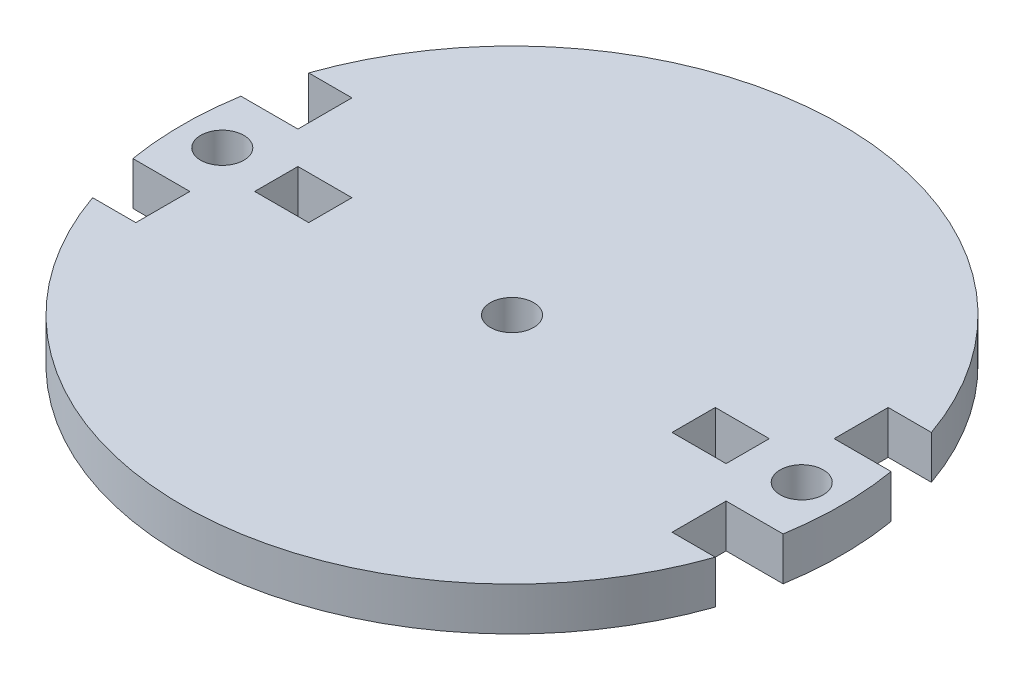
ISO-10303-21;
HEADER;
FILE_DESCRIPTION(('STEP AP214'),'2;1');
FILE_NAME('part.step','',(''),(''),'','','');
FILE_SCHEMA(('AUTOMOTIVE_DESIGN { 1 0 10303 214 1 1 1 1 }'));
ENDSEC;
DATA;
#1=APPLICATION_CONTEXT('core data for automotive mechanical design processes');
#2=APPLICATION_PROTOCOL_DEFINITION('international standard','automotive_design',2000,#1);
#3=PRODUCT_CONTEXT('',#1,'mechanical');
#4=PRODUCT('Part','Part','',(#3));
#5=PRODUCT_RELATED_PRODUCT_CATEGORY('part','',(#4));
#6=PRODUCT_DEFINITION_FORMATION('','',#4);
#7=PRODUCT_DEFINITION_CONTEXT('part definition',#1,'design');
#8=PRODUCT_DEFINITION('design','',#6,#7);
#9=PRODUCT_DEFINITION_SHAPE('','',#8);
#10=(LENGTH_UNIT() NAMED_UNIT(*) SI_UNIT(.MILLI.,.METRE.));
#11=(NAMED_UNIT(*) PLANE_ANGLE_UNIT() SI_UNIT($,.RADIAN.));
#12=(NAMED_UNIT(*) SI_UNIT($,.STERADIAN.) SOLID_ANGLE_UNIT());
#13=UNCERTAINTY_MEASURE_WITH_UNIT(LENGTH_MEASURE(1.E-05),#10,'distance_accuracy_value','');
#14=(GEOMETRIC_REPRESENTATION_CONTEXT(3) GLOBAL_UNCERTAINTY_ASSIGNED_CONTEXT((#13)) GLOBAL_UNIT_ASSIGNED_CONTEXT((#10,
#11,#12)) REPRESENTATION_CONTEXT('',''));
#15=CARTESIAN_POINT('',(0.,0.,0.));
#16=DIRECTION('',(0.,0.,1.));
#17=DIRECTION('',(1.,0.,0.));
#18=AXIS2_PLACEMENT_3D('',#15,#16,#17);
#19=CARTESIAN_POINT('',(0.,4.,0.));
#20=DIRECTION('',(0.,1.,0.));
#21=DIRECTION('',(0.,0.,1.));
#22=AXIS2_PLACEMENT_3D('',#19,#20,#21);
#23=PLANE('',#22);
#24=CARTESIAN_POINT('',(-26.8140590684478,4.,0.));
#25=DIRECTION('',(0.,1.,0.));
#26=DIRECTION('',(0.,0.,1.));
#27=AXIS2_PLACEMENT_3D('',#24,#25,#26);
#28=CIRCLE('',#27,2.);
#29=CARTESIAN_POINT('',(-26.8140590684478,4.,2.));
#30=VERTEX_POINT('',#29);
#31=EDGE_CURVE('E485',#30,#30,#28,.T.);
#32=ORIENTED_EDGE('',*,*,#31,.F.);
#33=EDGE_LOOP('',(#32));
#34=FACE_BOUND('',#33,.T.);
#35=CARTESIAN_POINT('',(26.8140590684478,4.,0.));
#36=DIRECTION('',(0.,1.,0.));
#37=DIRECTION('',(0.,0.,-1.));
#38=AXIS2_PLACEMENT_3D('',#35,#36,#37);
#39=CIRCLE('',#38,2.);
#40=CARTESIAN_POINT('',(26.8140590684478,4.,-2.));
#41=VERTEX_POINT('',#40);
#42=EDGE_CURVE('E220',#41,#41,#39,.T.);
#43=ORIENTED_EDGE('',*,*,#42,.F.);
#44=EDGE_LOOP('',(#43));
#45=FACE_BOUND('',#44,.T.);
#46=DIRECTION('',(0.,0.,1.));
#47=VECTOR('',#46,1.);
#48=CARTESIAN_POINT('',(16.8140590684478,4.,2.));
#49=LINE('',#48,#47);
#50=CARTESIAN_POINT('',(16.8140590684478,4.,-2.));
#51=VERTEX_POINT('',#50);
#52=CARTESIAN_POINT('',(16.8140590684478,4.,2.));
#53=VERTEX_POINT('',#52);
#54=EDGE_CURVE('E50',#51,#53,#49,.T.);
#55=ORIENTED_EDGE('',*,*,#54,.F.);
#56=DIRECTION('',(-1.,0.,0.));
#57=VECTOR('',#56,1.);
#58=CARTESIAN_POINT('',(16.8140590684478,4.,-2.));
#59=LINE('',#58,#57);
#60=CARTESIAN_POINT('',(21.8140590684478,4.,-2.));
#61=VERTEX_POINT('',#60);
#62=EDGE_CURVE('E214',#61,#51,#59,.T.);
#63=ORIENTED_EDGE('',*,*,#62,.F.);
#64=DIRECTION('',(0.,0.,-1.));
#65=VECTOR('',#64,1.);
#66=CARTESIAN_POINT('',(21.8140590684478,4.,-2.));
#67=LINE('',#66,#65);
#68=CARTESIAN_POINT('',(21.8140590684478,4.,2.));
#69=VERTEX_POINT('',#68);
#70=EDGE_CURVE('E217',#69,#61,#67,.T.);
#71=ORIENTED_EDGE('',*,*,#70,.F.);
#72=DIRECTION('',(1.,0.,0.));
#73=VECTOR('',#72,1.);
#74=CARTESIAN_POINT('',(16.8140590684478,4.,2.));
#75=LINE('',#74,#73);
#76=EDGE_CURVE('E226',#53,#69,#75,.T.);
#77=ORIENTED_EDGE('',*,*,#76,.F.);
#78=EDGE_LOOP('',(#55,#63,#71,#77));
#79=FACE_BOUND('',#78,.T.);
#80=DIRECTION('',(0.,0.,-1.));
#81=VECTOR('',#80,1.);
#82=CARTESIAN_POINT('',(-16.8140590684478,4.,2.));
#83=LINE('',#82,#81);
#84=CARTESIAN_POINT('',(-16.8140590684478,4.,2.));
#85=VERTEX_POINT('',#84);
#86=CARTESIAN_POINT('',(-16.8140590684478,4.,-2.));
#87=VERTEX_POINT('',#86);
#88=EDGE_CURVE('E233',#85,#87,#83,.T.);
#89=ORIENTED_EDGE('',*,*,#88,.F.);
#90=DIRECTION('',(1.,0.,0.));
#91=VECTOR('',#90,1.);
#92=CARTESIAN_POINT('',(-16.8140590684478,4.,2.));
#93=LINE('',#92,#91);
#94=CARTESIAN_POINT('',(-21.8140590684478,4.,2.));
#95=VERTEX_POINT('',#94);
#96=EDGE_CURVE('E241',#95,#85,#93,.T.);
#97=ORIENTED_EDGE('',*,*,#96,.F.);
#98=DIRECTION('',(0.,0.,1.));
#99=VECTOR('',#98,1.);
#100=CARTESIAN_POINT('',(-21.8140590684478,4.,-2.));
#101=LINE('',#100,#99);
#102=CARTESIAN_POINT('',(-21.8140590684478,4.,-2.));
#103=VERTEX_POINT('',#102);
#104=EDGE_CURVE('E255',#103,#95,#101,.T.);
#105=ORIENTED_EDGE('',*,*,#104,.F.);
#106=DIRECTION('',(-1.,0.,0.));
#107=VECTOR('',#106,1.);
#108=CARTESIAN_POINT('',(-16.8140590684478,4.,-2.));
#109=LINE('',#108,#107);
#110=EDGE_CURVE('E252',#87,#103,#109,.T.);
#111=ORIENTED_EDGE('',*,*,#110,.F.);
#112=EDGE_LOOP('',(#89,#97,#105,#111));
#113=FACE_BOUND('',#112,.T.);
#114=CARTESIAN_POINT('',(0.,4.,0.));
#115=DIRECTION('',(0.,1.,0.));
#116=DIRECTION('',(0.,0.,1.));
#117=AXIS2_PLACEMENT_3D('',#114,#115,#116);
#118=CIRCLE('',#117,2.);
#119=CARTESIAN_POINT('',(0.,4.,2.));
#120=VERTEX_POINT('',#119);
#121=EDGE_CURVE('E364',#120,#120,#118,.T.);
#122=ORIENTED_EDGE('',*,*,#121,.F.);
#123=EDGE_LOOP('',(#122));
#124=FACE_BOUND('',#123,.T.);
#125=DIRECTION('',(0.,0.,1.));
#126=VECTOR('',#125,1.);
#127=CARTESIAN_POINT('',(24.8140590684478,4.,0.));
#128=LINE('',#127,#126);
#129=CARTESIAN_POINT('',(24.8140590684478,4.,5.));
#130=VERTEX_POINT('',#129);
#131=CARTESIAN_POINT('',(24.8140590684478,4.,10.));
#132=VERTEX_POINT('',#131);
#133=EDGE_CURVE('E262',#130,#132,#128,.T.);
#134=ORIENTED_EDGE('',*,*,#133,.F.);
#135=DIRECTION('',(1.,0.,0.));
#136=VECTOR('',#135,1.);
#137=CARTESIAN_POINT('',(0.,4.,5.));
#138=LINE('',#137,#136);
#139=CARTESIAN_POINT('',(30.0873727666608,4.,5.));
#140=VERTEX_POINT('',#139);
#141=EDGE_CURVE('E273',#130,#140,#138,.T.);
#142=ORIENTED_EDGE('',*,*,#141,.T.);
#143=CARTESIAN_POINT('',(0.,4.,0.));
#144=DIRECTION('',(0.,1.,0.));
#145=DIRECTION('',(0.,0.,1.));
#146=AXIS2_PLACEMENT_3D('',#143,#144,#145);
#147=CIRCLE('',#146,30.5);
#148=CARTESIAN_POINT('',(30.0873727666608,4.,-5.));
#149=VERTEX_POINT('',#148);
#150=EDGE_CURVE('E42',#140,#149,#147,.T.);
#151=ORIENTED_EDGE('',*,*,#150,.T.);
#152=DIRECTION('',(1.,0.,0.));
#153=VECTOR('',#152,1.);
#154=CARTESIAN_POINT('',(0.,4.,-5.00000000000001));
#155=LINE('',#154,#153);
#156=CARTESIAN_POINT('',(24.8140590684478,4.,-5.));
#157=VERTEX_POINT('',#156);
#158=EDGE_CURVE('E297',#157,#149,#155,.T.);
#159=ORIENTED_EDGE('',*,*,#158,.F.);
#160=DIRECTION('',(0.,0.,-1.));
#161=VECTOR('',#160,1.);
#162=CARTESIAN_POINT('',(24.8140590684478,4.,0.));
#163=LINE('',#162,#161);
#164=CARTESIAN_POINT('',(24.8140590684478,4.,-10.));
#165=VERTEX_POINT('',#164);
#166=EDGE_CURVE('E305',#157,#165,#163,.T.);
#167=ORIENTED_EDGE('',*,*,#166,.T.);
#168=DIRECTION('',(1.,0.,0.));
#169=VECTOR('',#168,1.);
#170=CARTESIAN_POINT('',(0.,4.,-10.));
#171=LINE('',#170,#169);
#172=CARTESIAN_POINT('',(28.8140590684478,4.,-10.));
#173=VERTEX_POINT('',#172);
#174=EDGE_CURVE('E287',#165,#173,#171,.T.);
#175=ORIENTED_EDGE('',*,*,#174,.T.);
#176=CARTESIAN_POINT('',(-28.8140590684478,4.,-10.));
#177=VERTEX_POINT('',#176);
#178=EDGE_CURVE('E430',#173,#177,#147,.T.);
#179=ORIENTED_EDGE('',*,*,#178,.T.);
#180=DIRECTION('',(-1.,0.,0.));
#181=VECTOR('',#180,1.);
#182=CARTESIAN_POINT('',(0.,4.,-10.));
#183=LINE('',#182,#181);
#184=CARTESIAN_POINT('',(-24.8140590684478,4.,-10.));
#185=VERTEX_POINT('',#184);
#186=EDGE_CURVE('E322',#185,#177,#183,.T.);
#187=ORIENTED_EDGE('',*,*,#186,.F.);
#188=DIRECTION('',(0.,0.,-1.));
#189=VECTOR('',#188,1.);
#190=CARTESIAN_POINT('',(-24.8140590684478,4.,0.));
#191=LINE('',#190,#189);
#192=CARTESIAN_POINT('',(-24.8140590684478,4.,-5.));
#193=VERTEX_POINT('',#192);
#194=EDGE_CURVE('E331',#193,#185,#191,.T.);
#195=ORIENTED_EDGE('',*,*,#194,.F.);
#196=DIRECTION('',(-1.,0.,0.));
#197=VECTOR('',#196,1.);
#198=CARTESIAN_POINT('',(0.,4.,-5.));
#199=LINE('',#198,#197);
#200=CARTESIAN_POINT('',(-30.0873727666608,4.,-5.));
#201=VERTEX_POINT('',#200);
#202=EDGE_CURVE('E312',#193,#201,#199,.T.);
#203=ORIENTED_EDGE('',*,*,#202,.T.);
#204=CARTESIAN_POINT('',(-30.0873727666608,4.,5.));
#205=VERTEX_POINT('',#204);
#206=EDGE_CURVE('E43',#201,#205,#147,.T.);
#207=ORIENTED_EDGE('',*,*,#206,.T.);
#208=DIRECTION('',(-1.,0.,0.));
#209=VECTOR('',#208,1.);
#210=CARTESIAN_POINT('',(0.,4.,5.00000000000001));
#211=LINE('',#210,#209);
#212=CARTESIAN_POINT('',(-24.8140590684478,4.,5.));
#213=VERTEX_POINT('',#212);
#214=EDGE_CURVE('E338',#213,#205,#211,.T.);
#215=ORIENTED_EDGE('',*,*,#214,.F.);
#216=DIRECTION('',(0.,0.,1.));
#217=VECTOR('',#216,1.);
#218=CARTESIAN_POINT('',(-24.8140590684478,4.,0.));
#219=LINE('',#218,#217);
#220=CARTESIAN_POINT('',(-24.8140590684478,4.,10.));
#221=VERTEX_POINT('',#220);
#222=EDGE_CURVE('E349',#213,#221,#219,.T.);
#223=ORIENTED_EDGE('',*,*,#222,.T.);
#224=DIRECTION('',(-1.,0.,0.));
#225=VECTOR('',#224,1.);
#226=CARTESIAN_POINT('',(0.,4.,10.));
#227=LINE('',#226,#225);
#228=CARTESIAN_POINT('',(-28.8140590684478,4.,10.));
#229=VERTEX_POINT('',#228);
#230=EDGE_CURVE('E357',#221,#229,#227,.T.);
#231=ORIENTED_EDGE('',*,*,#230,.T.);
#232=CARTESIAN_POINT('',(28.8140590684478,4.,10.));
#233=VERTEX_POINT('',#232);
#234=EDGE_CURVE('E11',#229,#233,#147,.T.);
#235=ORIENTED_EDGE('',*,*,#234,.T.);
#236=DIRECTION('',(1.,0.,0.));
#237=VECTOR('',#236,1.);
#238=CARTESIAN_POINT('',(0.,4.,10.));
#239=LINE('',#238,#237);
#240=EDGE_CURVE('E281',#132,#233,#239,.T.);
#241=ORIENTED_EDGE('',*,*,#240,.F.);
#242=EDGE_LOOP('',(#134,#142,#151,#159,#167,#175,#179,#187,#195,#203,#207,#215,#223,#231,#235,#241));
#243=FACE_BOUND('',#242,.T.);
#244=ADVANCED_FACE('F33',(#34,#45,#79,#113,#124,#243),#23,.T.);
#245=CARTESIAN_POINT('',(0.,0.,0.));
#246=DIRECTION('',(0.,1.,0.));
#247=DIRECTION('',(0.,0.,1.));
#248=AXIS2_PLACEMENT_3D('',#245,#246,#247);
#249=PLANE('',#248);
#250=CARTESIAN_POINT('',(-26.8140590684478,0.,0.));
#251=DIRECTION('',(0.,1.,0.));
#252=DIRECTION('',(0.,0.,1.));
#253=AXIS2_PLACEMENT_3D('',#250,#251,#252);
#254=CIRCLE('',#253,2.);
#255=CARTESIAN_POINT('',(-26.8140590684478,0.,2.));
#256=VERTEX_POINT('',#255);
#257=EDGE_CURVE('E479',#256,#256,#254,.T.);
#258=ORIENTED_EDGE('',*,*,#257,.T.);
#259=EDGE_LOOP('',(#258));
#260=FACE_BOUND('',#259,.T.);
#261=CARTESIAN_POINT('',(26.8140590684478,0.,0.));
#262=DIRECTION('',(0.,1.,0.));
#263=DIRECTION('',(0.,0.,-1.));
#264=AXIS2_PLACEMENT_3D('',#261,#262,#263);
#265=CIRCLE('',#264,2.);
#266=CARTESIAN_POINT('',(26.8140590684478,0.,-2.));
#267=VERTEX_POINT('',#266);
#268=EDGE_CURVE('E227',#267,#267,#265,.T.);
#269=ORIENTED_EDGE('',*,*,#268,.T.);
#270=EDGE_LOOP('',(#269));
#271=FACE_BOUND('',#270,.T.);
#272=DIRECTION('',(-1.,0.,0.));
#273=VECTOR('',#272,1.);
#274=CARTESIAN_POINT('',(16.8140590684478,0.,-2.));
#275=LINE('',#274,#273);
#276=CARTESIAN_POINT('',(21.8140590684478,0.,-2.));
#277=VERTEX_POINT('',#276);
#278=CARTESIAN_POINT('',(16.8140590684478,0.,-2.));
#279=VERTEX_POINT('',#278);
#280=EDGE_CURVE('E204',#277,#279,#275,.T.);
#281=ORIENTED_EDGE('',*,*,#280,.T.);
#282=DIRECTION('',(0.,0.,1.));
#283=VECTOR('',#282,1.);
#284=CARTESIAN_POINT('',(16.8140590684478,0.,2.));
#285=LINE('',#284,#283);
#286=CARTESIAN_POINT('',(16.8140590684478,0.,2.));
#287=VERTEX_POINT('',#286);
#288=EDGE_CURVE('E198',#279,#287,#285,.T.);
#289=ORIENTED_EDGE('',*,*,#288,.T.);
#290=DIRECTION('',(1.,0.,0.));
#291=VECTOR('',#290,1.);
#292=CARTESIAN_POINT('',(16.8140590684478,0.,2.));
#293=LINE('',#292,#291);
#294=CARTESIAN_POINT('',(21.8140590684478,0.,2.));
#295=VERTEX_POINT('',#294);
#296=EDGE_CURVE('E207',#287,#295,#293,.T.);
#297=ORIENTED_EDGE('',*,*,#296,.T.);
#298=DIRECTION('',(0.,0.,-1.));
#299=VECTOR('',#298,1.);
#300=CARTESIAN_POINT('',(21.8140590684478,0.,-2.));
#301=LINE('',#300,#299);
#302=EDGE_CURVE('E58',#295,#277,#301,.T.);
#303=ORIENTED_EDGE('',*,*,#302,.T.);
#304=EDGE_LOOP('',(#281,#289,#297,#303));
#305=FACE_BOUND('',#304,.T.);
#306=DIRECTION('',(1.,0.,0.));
#307=VECTOR('',#306,1.);
#308=CARTESIAN_POINT('',(-16.8140590684478,0.,2.));
#309=LINE('',#308,#307);
#310=CARTESIAN_POINT('',(-21.8140590684478,0.,2.));
#311=VERTEX_POINT('',#310);
#312=CARTESIAN_POINT('',(-16.8140590684478,0.,2.));
#313=VERTEX_POINT('',#312);
#314=EDGE_CURVE('E247',#311,#313,#309,.T.);
#315=ORIENTED_EDGE('',*,*,#314,.T.);
#316=DIRECTION('',(0.,0.,-1.));
#317=VECTOR('',#316,1.);
#318=CARTESIAN_POINT('',(-16.8140590684478,0.,2.));
#319=LINE('',#318,#317);
#320=CARTESIAN_POINT('',(-16.8140590684478,0.,-2.));
#321=VERTEX_POINT('',#320);
#322=EDGE_CURVE('E237',#313,#321,#319,.T.);
#323=ORIENTED_EDGE('',*,*,#322,.T.);
#324=DIRECTION('',(-1.,0.,0.));
#325=VECTOR('',#324,1.);
#326=CARTESIAN_POINT('',(-16.8140590684478,0.,-2.));
#327=LINE('',#326,#325);
#328=CARTESIAN_POINT('',(-21.8140590684478,0.,-2.));
#329=VERTEX_POINT('',#328);
#330=EDGE_CURVE('E240',#321,#329,#327,.T.);
#331=ORIENTED_EDGE('',*,*,#330,.T.);
#332=DIRECTION('',(0.,0.,1.));
#333=VECTOR('',#332,1.);
#334=CARTESIAN_POINT('',(-21.8140590684478,0.,-2.));
#335=LINE('',#334,#333);
#336=EDGE_CURVE('E244',#329,#311,#335,.T.);
#337=ORIENTED_EDGE('',*,*,#336,.T.);
#338=EDGE_LOOP('',(#315,#323,#331,#337));
#339=FACE_BOUND('',#338,.T.);
#340=CARTESIAN_POINT('',(0.,0.,0.));
#341=DIRECTION('',(0.,1.,0.));
#342=DIRECTION('',(0.,0.,1.));
#343=AXIS2_PLACEMENT_3D('',#340,#341,#342);
#344=CIRCLE('',#343,2.);
#345=CARTESIAN_POINT('',(0.,0.,2.));
#346=VERTEX_POINT('',#345);
#347=EDGE_CURVE('E371',#346,#346,#344,.T.);
#348=ORIENTED_EDGE('',*,*,#347,.T.);
#349=EDGE_LOOP('',(#348));
#350=FACE_BOUND('',#349,.T.);
#351=DIRECTION('',(1.,0.,0.));
#352=VECTOR('',#351,1.);
#353=CARTESIAN_POINT('',(0.,0.,5.));
#354=LINE('',#353,#352);
#355=CARTESIAN_POINT('',(24.8140590684478,0.,5.));
#356=VERTEX_POINT('',#355);
#357=CARTESIAN_POINT('',(30.0873727666608,0.,5.));
#358=VERTEX_POINT('',#357);
#359=EDGE_CURVE('E276',#356,#358,#354,.T.);
#360=ORIENTED_EDGE('',*,*,#359,.F.);
#361=DIRECTION('',(0.,0.,1.));
#362=VECTOR('',#361,1.);
#363=CARTESIAN_POINT('',(24.8140590684478,0.,0.));
#364=LINE('',#363,#362);
#365=CARTESIAN_POINT('',(24.8140590684478,0.,10.));
#366=VERTEX_POINT('',#365);
#367=EDGE_CURVE('E269',#356,#366,#364,.T.);
#368=ORIENTED_EDGE('',*,*,#367,.T.);
#369=DIRECTION('',(1.,0.,0.));
#370=VECTOR('',#369,1.);
#371=CARTESIAN_POINT('',(0.,0.,10.));
#372=LINE('',#371,#370);
#373=CARTESIAN_POINT('',(28.8140590684478,0.,10.));
#374=VERTEX_POINT('',#373);
#375=EDGE_CURVE('E272',#366,#374,#372,.T.);
#376=ORIENTED_EDGE('',*,*,#375,.T.);
#377=CARTESIAN_POINT('',(0.,0.,0.));
#378=DIRECTION('',(0.,1.,0.));
#379=DIRECTION('',(0.,0.,1.));
#380=AXIS2_PLACEMENT_3D('',#377,#378,#379);
#381=CIRCLE('',#380,30.5);
#382=CARTESIAN_POINT('',(-28.8140590684478,0.,10.));
#383=VERTEX_POINT('',#382);
#384=EDGE_CURVE('E37',#383,#374,#381,.T.);
#385=ORIENTED_EDGE('',*,*,#384,.F.);
#386=DIRECTION('',(-1.,0.,0.));
#387=VECTOR('',#386,1.);
#388=CARTESIAN_POINT('',(0.,0.,10.));
#389=LINE('',#388,#387);
#390=CARTESIAN_POINT('',(-24.8140590684478,0.,10.));
#391=VERTEX_POINT('',#390);
#392=EDGE_CURVE('E348',#391,#383,#389,.T.);
#393=ORIENTED_EDGE('',*,*,#392,.F.);
#394=DIRECTION('',(0.,0.,1.));
#395=VECTOR('',#394,1.);
#396=CARTESIAN_POINT('',(-24.8140590684478,0.,0.));
#397=LINE('',#396,#395);
#398=CARTESIAN_POINT('',(-24.8140590684478,0.,5.));
#399=VERTEX_POINT('',#398);
#400=EDGE_CURVE('E351',#399,#391,#397,.T.);
#401=ORIENTED_EDGE('',*,*,#400,.F.);
#402=DIRECTION('',(-1.,0.,0.));
#403=VECTOR('',#402,1.);
#404=CARTESIAN_POINT('',(0.,0.,5.00000000000001));
#405=LINE('',#404,#403);
#406=CARTESIAN_POINT('',(-30.0873727666608,0.,5.));
#407=VERTEX_POINT('',#406);
#408=EDGE_CURVE('E345',#399,#407,#405,.T.);
#409=ORIENTED_EDGE('',*,*,#408,.T.);
#410=CARTESIAN_POINT('',(-30.0873727666608,0.,-5.));
#411=VERTEX_POINT('',#410);
#412=EDGE_CURVE('E374',#411,#407,#381,.T.);
#413=ORIENTED_EDGE('',*,*,#412,.F.);
#414=DIRECTION('',(-1.,0.,0.));
#415=VECTOR('',#414,1.);
#416=CARTESIAN_POINT('',(0.,0.,-5.));
#417=LINE('',#416,#415);
#418=CARTESIAN_POINT('',(-24.8140590684478,0.,-5.));
#419=VERTEX_POINT('',#418);
#420=EDGE_CURVE('E319',#419,#411,#417,.T.);
#421=ORIENTED_EDGE('',*,*,#420,.F.);
#422=DIRECTION('',(0.,0.,-1.));
#423=VECTOR('',#422,1.);
#424=CARTESIAN_POINT('',(-24.8140590684478,0.,0.));
#425=LINE('',#424,#423);
#426=CARTESIAN_POINT('',(-24.8140590684478,0.,-10.));
#427=VERTEX_POINT('',#426);
#428=EDGE_CURVE('E321',#419,#427,#425,.T.);
#429=ORIENTED_EDGE('',*,*,#428,.T.);
#430=DIRECTION('',(-1.,0.,0.));
#431=VECTOR('',#430,1.);
#432=CARTESIAN_POINT('',(0.,0.,-10.));
#433=LINE('',#432,#431);
#434=CARTESIAN_POINT('',(-28.8140590684478,0.,-10.));
#435=VERTEX_POINT('',#434);
#436=EDGE_CURVE('E325',#427,#435,#433,.T.);
#437=ORIENTED_EDGE('',*,*,#436,.T.);
#438=CARTESIAN_POINT('',(28.8140590684478,0.,-10.));
#439=VERTEX_POINT('',#438);
#440=EDGE_CURVE('E404',#439,#435,#381,.T.);
#441=ORIENTED_EDGE('',*,*,#440,.F.);
#442=DIRECTION('',(1.,0.,0.));
#443=VECTOR('',#442,1.);
#444=CARTESIAN_POINT('',(0.,0.,-10.));
#445=LINE('',#444,#443);
#446=CARTESIAN_POINT('',(24.8140590684478,0.,-10.));
#447=VERTEX_POINT('',#446);
#448=EDGE_CURVE('E294',#447,#439,#445,.T.);
#449=ORIENTED_EDGE('',*,*,#448,.F.);
#450=DIRECTION('',(0.,0.,-1.));
#451=VECTOR('',#450,1.);
#452=CARTESIAN_POINT('',(24.8140590684478,0.,0.));
#453=LINE('',#452,#451);
#454=CARTESIAN_POINT('',(24.8140590684478,0.,-5.));
#455=VERTEX_POINT('',#454);
#456=EDGE_CURVE('E296',#455,#447,#453,.T.);
#457=ORIENTED_EDGE('',*,*,#456,.F.);
#458=DIRECTION('',(1.,0.,0.));
#459=VECTOR('',#458,1.);
#460=CARTESIAN_POINT('',(0.,0.,-5.00000000000001));
#461=LINE('',#460,#459);
#462=CARTESIAN_POINT('',(30.0873727666608,0.,-5.));
#463=VERTEX_POINT('',#462);
#464=EDGE_CURVE('E299',#455,#463,#461,.T.);
#465=ORIENTED_EDGE('',*,*,#464,.T.);
#466=EDGE_CURVE('E399',#358,#463,#381,.T.);
#467=ORIENTED_EDGE('',*,*,#466,.F.);
#468=EDGE_LOOP('',(#360,#368,#376,#385,#393,#401,#409,#413,#421,#429,#437,#441,#449,#457,#465,#467));
#469=FACE_BOUND('',#468,.T.);
#470=ADVANCED_FACE('F211',(#260,#271,#305,#339,#350,#469),#249,.F.);
#471=CARTESIAN_POINT('',(0.,4.,0.));
#472=DIRECTION('',(0.,-1.,0.));
#473=DIRECTION('',(0.,0.,-1.));
#474=AXIS2_PLACEMENT_3D('',#471,#472,#473);
#475=CYLINDRICAL_SURFACE('',#474,30.5);
#476=DIRECTION('',(0.,1.,0.));
#477=VECTOR('',#476,1.);
#478=CARTESIAN_POINT('',(30.0873727666608,0.,5.));
#479=LINE('',#478,#477);
#480=EDGE_CURVE('E288',#358,#140,#479,.T.);
#481=ORIENTED_EDGE('',*,*,#480,.F.);
#482=ORIENTED_EDGE('',*,*,#466,.T.);
#483=DIRECTION('',(0.,1.,0.));
#484=VECTOR('',#483,1.);
#485=CARTESIAN_POINT('',(30.0873727666608,0.,-5.));
#486=LINE('',#485,#484);
#487=EDGE_CURVE('E313',#463,#149,#486,.T.);
#488=ORIENTED_EDGE('',*,*,#487,.T.);
#489=ORIENTED_EDGE('',*,*,#150,.F.);
#490=EDGE_LOOP('',(#481,#482,#488,#489));
#491=FACE_BOUND('',#490,.T.);
#492=ADVANCED_FACE('F398',(#491),#475,.T.);
#493=DIRECTION('',(0.,1.,0.));
#494=VECTOR('',#493,1.);
#495=CARTESIAN_POINT('',(28.8140590684478,0.,-10.));
#496=LINE('',#495,#494);
#497=EDGE_CURVE('E310',#439,#173,#496,.T.);
#498=ORIENTED_EDGE('',*,*,#497,.F.);
#499=ORIENTED_EDGE('',*,*,#440,.T.);
#500=DIRECTION('',(0.,1.,0.));
#501=VECTOR('',#500,1.);
#502=CARTESIAN_POINT('',(-28.8140590684478,0.,-10.));
#503=LINE('',#502,#501);
#504=EDGE_CURVE('E339',#435,#177,#503,.T.);
#505=ORIENTED_EDGE('',*,*,#504,.T.);
#506=ORIENTED_EDGE('',*,*,#178,.F.);
#507=EDGE_LOOP('',(#498,#499,#505,#506));
#508=FACE_BOUND('',#507,.T.);
#509=ADVANCED_FACE('F442',(#508),#475,.T.);
#510=DIRECTION('',(0.,1.,0.));
#511=VECTOR('',#510,1.);
#512=CARTESIAN_POINT('',(-30.0873727666608,0.,-5.));
#513=LINE('',#512,#511);
#514=EDGE_CURVE('E336',#411,#201,#513,.T.);
#515=ORIENTED_EDGE('',*,*,#514,.F.);
#516=ORIENTED_EDGE('',*,*,#412,.T.);
#517=DIRECTION('',(0.,1.,0.));
#518=VECTOR('',#517,1.);
#519=CARTESIAN_POINT('',(-30.0873727666608,0.,5.));
#520=LINE('',#519,#518);
#521=EDGE_CURVE('E354',#407,#205,#520,.T.);
#522=ORIENTED_EDGE('',*,*,#521,.T.);
#523=ORIENTED_EDGE('',*,*,#206,.F.);
#524=EDGE_LOOP('',(#515,#516,#522,#523));
#525=FACE_BOUND('',#524,.T.);
#526=ADVANCED_FACE('F414',(#525),#475,.T.);
#527=ORIENTED_EDGE('',*,*,#384,.T.);
#528=DIRECTION('',(0.,1.,0.));
#529=VECTOR('',#528,1.);
#530=CARTESIAN_POINT('',(28.8140590684478,0.,10.));
#531=LINE('',#530,#529);
#532=EDGE_CURVE('E290',#374,#233,#531,.T.);
#533=ORIENTED_EDGE('',*,*,#532,.T.);
#534=ORIENTED_EDGE('',*,*,#234,.F.);
#535=DIRECTION('',(0.,1.,0.));
#536=VECTOR('',#535,1.);
#537=CARTESIAN_POINT('',(-28.8140590684478,0.,10.));
#538=LINE('',#537,#536);
#539=EDGE_CURVE('E367',#383,#229,#538,.T.);
#540=ORIENTED_EDGE('',*,*,#539,.F.);
#541=EDGE_LOOP('',(#527,#533,#534,#540));
#542=FACE_BOUND('',#541,.T.);
#543=ADVANCED_FACE('F35',(#542),#475,.T.);
#544=CARTESIAN_POINT('',(0.,0.,0.));
#545=DIRECTION('',(0.,1.,0.));
#546=DIRECTION('',(0.,0.,1.));
#547=AXIS2_PLACEMENT_3D('',#544,#545,#546);
#548=CYLINDRICAL_SURFACE('',#547,2.);
#549=ORIENTED_EDGE('',*,*,#347,.F.);
#550=EDGE_LOOP('',(#549));
#551=FACE_BOUND('',#550,.T.);
#552=ORIENTED_EDGE('',*,*,#121,.T.);
#553=EDGE_LOOP('',(#552));
#554=FACE_BOUND('',#553,.T.);
#555=ADVANCED_FACE('F378',(#551,#554),#548,.F.);
#556=CARTESIAN_POINT('',(0.,0.,5.00000000000001));
#557=DIRECTION('',(0.,0.,-1.));
#558=DIRECTION('',(-1.,0.,0.));
#559=AXIS2_PLACEMENT_3D('',#556,#557,#558);
#560=PLANE('',#559);
#561=ORIENTED_EDGE('',*,*,#214,.T.);
#562=ORIENTED_EDGE('',*,*,#521,.F.);
#563=ORIENTED_EDGE('',*,*,#408,.F.);
#564=DIRECTION('',(0.,1.,0.));
#565=VECTOR('',#564,1.);
#566=CARTESIAN_POINT('',(-24.8140590684478,0.,5.));
#567=LINE('',#566,#565);
#568=EDGE_CURVE('E362',#399,#213,#567,.T.);
#569=ORIENTED_EDGE('',*,*,#568,.T.);
#570=EDGE_LOOP('',(#561,#562,#563,#569));
#571=FACE_BOUND('',#570,.T.);
#572=ADVANCED_FACE('F419',(#571),#560,.F.);
#573=CARTESIAN_POINT('',(-24.8140590684478,0.,0.));
#574=DIRECTION('',(-1.,0.,0.));
#575=DIRECTION('',(0.,0.,1.));
#576=AXIS2_PLACEMENT_3D('',#573,#574,#575);
#577=PLANE('',#576);
#578=ORIENTED_EDGE('',*,*,#222,.F.);
#579=ORIENTED_EDGE('',*,*,#568,.F.);
#580=ORIENTED_EDGE('',*,*,#400,.T.);
#581=DIRECTION('',(0.,1.,0.));
#582=VECTOR('',#581,1.);
#583=CARTESIAN_POINT('',(-24.8140590684478,0.,10.));
#584=LINE('',#583,#582);
#585=EDGE_CURVE('E365',#391,#221,#584,.T.);
#586=ORIENTED_EDGE('',*,*,#585,.T.);
#587=EDGE_LOOP('',(#578,#579,#580,#586));
#588=FACE_BOUND('',#587,.T.);
#589=ADVANCED_FACE('F426',(#588),#577,.T.);
#590=CARTESIAN_POINT('',(0.,0.,10.));
#591=DIRECTION('',(0.,0.,-1.));
#592=DIRECTION('',(-1.,0.,0.));
#593=AXIS2_PLACEMENT_3D('',#590,#591,#592);
#594=PLANE('',#593);
#595=ORIENTED_EDGE('',*,*,#230,.F.);
#596=ORIENTED_EDGE('',*,*,#585,.F.);
#597=ORIENTED_EDGE('',*,*,#392,.T.);
#598=ORIENTED_EDGE('',*,*,#539,.T.);
#599=EDGE_LOOP('',(#595,#596,#597,#598));
#600=FACE_BOUND('',#599,.T.);
#601=ADVANCED_FACE('F453',(#600),#594,.T.);
#602=CARTESIAN_POINT('',(0.,0.,-5.));
#603=DIRECTION('',(0.,0.,-1.));
#604=DIRECTION('',(-1.,0.,0.));
#605=AXIS2_PLACEMENT_3D('',#602,#603,#604);
#606=PLANE('',#605);
#607=ORIENTED_EDGE('',*,*,#202,.F.);
#608=DIRECTION('',(0.,1.,0.));
#609=VECTOR('',#608,1.);
#610=CARTESIAN_POINT('',(-24.8140590684478,0.,-5.));
#611=LINE('',#610,#609);
#612=EDGE_CURVE('E328',#419,#193,#611,.T.);
#613=ORIENTED_EDGE('',*,*,#612,.F.);
#614=ORIENTED_EDGE('',*,*,#420,.T.);
#615=ORIENTED_EDGE('',*,*,#514,.T.);
#616=EDGE_LOOP('',(#607,#613,#614,#615));
#617=FACE_BOUND('',#616,.T.);
#618=ADVANCED_FACE('F451',(#617),#606,.T.);
#619=CARTESIAN_POINT('',(0.,0.,-10.));
#620=DIRECTION('',(0.,0.,-1.));
#621=DIRECTION('',(-1.,0.,0.));
#622=AXIS2_PLACEMENT_3D('',#619,#620,#621);
#623=PLANE('',#622);
#624=ORIENTED_EDGE('',*,*,#186,.T.);
#625=ORIENTED_EDGE('',*,*,#504,.F.);
#626=ORIENTED_EDGE('',*,*,#436,.F.);
#627=DIRECTION('',(0.,1.,0.));
#628=VECTOR('',#627,1.);
#629=CARTESIAN_POINT('',(-24.8140590684478,0.,-10.));
#630=LINE('',#629,#628);
#631=EDGE_CURVE('E342',#427,#185,#630,.T.);
#632=ORIENTED_EDGE('',*,*,#631,.T.);
#633=EDGE_LOOP('',(#624,#625,#626,#632));
#634=FACE_BOUND('',#633,.T.);
#635=ADVANCED_FACE('F444',(#634),#623,.F.);
#636=CARTESIAN_POINT('',(-24.8140590684478,0.,0.));
#637=DIRECTION('',(1.,0.,0.));
#638=DIRECTION('',(0.,0.,-1.));
#639=AXIS2_PLACEMENT_3D('',#636,#637,#638);
#640=PLANE('',#639);
#641=ORIENTED_EDGE('',*,*,#194,.T.);
#642=ORIENTED_EDGE('',*,*,#631,.F.);
#643=ORIENTED_EDGE('',*,*,#428,.F.);
#644=ORIENTED_EDGE('',*,*,#612,.T.);
#645=EDGE_LOOP('',(#641,#642,#643,#644));
#646=FACE_BOUND('',#645,.T.);
#647=ADVANCED_FACE('F449',(#646),#640,.F.);
#648=CARTESIAN_POINT('',(0.,0.,-10.));
#649=DIRECTION('',(0.,0.,1.));
#650=DIRECTION('',(1.,0.,0.));
#651=AXIS2_PLACEMENT_3D('',#648,#649,#650);
#652=PLANE('',#651);
#653=ORIENTED_EDGE('',*,*,#174,.F.);
#654=DIRECTION('',(0.,1.,0.));
#655=VECTOR('',#654,1.);
#656=CARTESIAN_POINT('',(24.8140590684478,0.,-10.));
#657=LINE('',#656,#655);
#658=EDGE_CURVE('E302',#447,#165,#657,.T.);
#659=ORIENTED_EDGE('',*,*,#658,.F.);
#660=ORIENTED_EDGE('',*,*,#448,.T.);
#661=ORIENTED_EDGE('',*,*,#497,.T.);
#662=EDGE_LOOP('',(#653,#659,#660,#661));
#663=FACE_BOUND('',#662,.T.);
#664=ADVANCED_FACE('F535',(#663),#652,.T.);
#665=CARTESIAN_POINT('',(0.,0.,-5.00000000000001));
#666=DIRECTION('',(0.,0.,1.));
#667=DIRECTION('',(1.,0.,0.));
#668=AXIS2_PLACEMENT_3D('',#665,#666,#667);
#669=PLANE('',#668);
#670=ORIENTED_EDGE('',*,*,#158,.T.);
#671=ORIENTED_EDGE('',*,*,#487,.F.);
#672=ORIENTED_EDGE('',*,*,#464,.F.);
#673=DIRECTION('',(0.,1.,0.));
#674=VECTOR('',#673,1.);
#675=CARTESIAN_POINT('',(24.8140590684478,0.,-5.));
#676=LINE('',#675,#674);
#677=EDGE_CURVE('E316',#455,#157,#676,.T.);
#678=ORIENTED_EDGE('',*,*,#677,.T.);
#679=EDGE_LOOP('',(#670,#671,#672,#678));
#680=FACE_BOUND('',#679,.T.);
#681=ADVANCED_FACE('F435',(#680),#669,.F.);
#682=CARTESIAN_POINT('',(24.8140590684478,0.,0.));
#683=DIRECTION('',(1.,0.,0.));
#684=DIRECTION('',(0.,0.,-1.));
#685=AXIS2_PLACEMENT_3D('',#682,#683,#684);
#686=PLANE('',#685);
#687=ORIENTED_EDGE('',*,*,#166,.F.);
#688=ORIENTED_EDGE('',*,*,#677,.F.);
#689=ORIENTED_EDGE('',*,*,#456,.T.);
#690=ORIENTED_EDGE('',*,*,#658,.T.);
#691=EDGE_LOOP('',(#687,#688,#689,#690));
#692=FACE_BOUND('',#691,.T.);
#693=ADVANCED_FACE('F438',(#692),#686,.T.);
#694=CARTESIAN_POINT('',(24.8140590684478,0.,0.));
#695=DIRECTION('',(-1.,0.,0.));
#696=DIRECTION('',(0.,0.,1.));
#697=AXIS2_PLACEMENT_3D('',#694,#695,#696);
#698=PLANE('',#697);
#699=ORIENTED_EDGE('',*,*,#133,.T.);
#700=DIRECTION('',(0.,1.,0.));
#701=VECTOR('',#700,1.);
#702=CARTESIAN_POINT('',(24.8140590684478,0.,10.));
#703=LINE('',#702,#701);
#704=EDGE_CURVE('E278',#366,#132,#703,.T.);
#705=ORIENTED_EDGE('',*,*,#704,.F.);
#706=ORIENTED_EDGE('',*,*,#367,.F.);
#707=DIRECTION('',(0.,1.,0.));
#708=VECTOR('',#707,1.);
#709=CARTESIAN_POINT('',(24.8140590684478,0.,5.));
#710=LINE('',#709,#708);
#711=EDGE_CURVE('E285',#356,#130,#710,.T.);
#712=ORIENTED_EDGE('',*,*,#711,.T.);
#713=EDGE_LOOP('',(#699,#705,#706,#712));
#714=FACE_BOUND('',#713,.T.);
#715=ADVANCED_FACE('F389',(#714),#698,.F.);
#716=CARTESIAN_POINT('',(0.,0.,5.));
#717=DIRECTION('',(0.,0.,1.));
#718=DIRECTION('',(1.,0.,0.));
#719=AXIS2_PLACEMENT_3D('',#716,#717,#718);
#720=PLANE('',#719);
#721=ORIENTED_EDGE('',*,*,#141,.F.);
#722=ORIENTED_EDGE('',*,*,#711,.F.);
#723=ORIENTED_EDGE('',*,*,#359,.T.);
#724=ORIENTED_EDGE('',*,*,#480,.T.);
#725=EDGE_LOOP('',(#721,#722,#723,#724));
#726=FACE_BOUND('',#725,.T.);
#727=ADVANCED_FACE('F394',(#726),#720,.T.);
#728=CARTESIAN_POINT('',(0.,0.,10.));
#729=DIRECTION('',(0.,0.,1.));
#730=DIRECTION('',(1.,0.,0.));
#731=AXIS2_PLACEMENT_3D('',#728,#729,#730);
#732=PLANE('',#731);
#733=ORIENTED_EDGE('',*,*,#240,.T.);
#734=ORIENTED_EDGE('',*,*,#532,.F.);
#735=ORIENTED_EDGE('',*,*,#375,.F.);
#736=ORIENTED_EDGE('',*,*,#704,.T.);
#737=EDGE_LOOP('',(#733,#734,#735,#736));
#738=FACE_BOUND('',#737,.T.);
#739=ADVANCED_FACE('F525',(#738),#732,.F.);
#740=CARTESIAN_POINT('',(-16.8140590684478,0.,2.));
#741=DIRECTION('',(1.,0.,0.));
#742=DIRECTION('',(0.,0.,-1.));
#743=AXIS2_PLACEMENT_3D('',#740,#741,#742);
#744=PLANE('',#743);
#745=ORIENTED_EDGE('',*,*,#88,.T.);
#746=DIRECTION('',(0.,1.,0.));
#747=VECTOR('',#746,1.);
#748=CARTESIAN_POINT('',(-16.8140590684478,0.,-2.));
#749=LINE('',#748,#747);
#750=EDGE_CURVE('E250',#321,#87,#749,.T.);
#751=ORIENTED_EDGE('',*,*,#750,.F.);
#752=ORIENTED_EDGE('',*,*,#322,.F.);
#753=DIRECTION('',(0.,1.,0.));
#754=VECTOR('',#753,1.);
#755=CARTESIAN_POINT('',(-16.8140590684478,0.,2.));
#756=LINE('',#755,#754);
#757=EDGE_CURVE('E260',#313,#85,#756,.T.);
#758=ORIENTED_EDGE('',*,*,#757,.T.);
#759=EDGE_LOOP('',(#745,#751,#752,#758));
#760=FACE_BOUND('',#759,.T.);
#761=ADVANCED_FACE('F501',(#760),#744,.F.);
#762=CARTESIAN_POINT('',(-16.8140590684478,0.,2.));
#763=DIRECTION('',(0.,0.,1.));
#764=DIRECTION('',(1.,0.,0.));
#765=AXIS2_PLACEMENT_3D('',#762,#763,#764);
#766=PLANE('',#765);
#767=ORIENTED_EDGE('',*,*,#96,.T.);
#768=ORIENTED_EDGE('',*,*,#757,.F.);
#769=ORIENTED_EDGE('',*,*,#314,.F.);
#770=DIRECTION('',(0.,1.,0.));
#771=VECTOR('',#770,1.);
#772=CARTESIAN_POINT('',(-21.8140590684478,0.,2.));
#773=LINE('',#772,#771);
#774=EDGE_CURVE('E263',#311,#95,#773,.T.);
#775=ORIENTED_EDGE('',*,*,#774,.T.);
#776=EDGE_LOOP('',(#767,#768,#769,#775));
#777=FACE_BOUND('',#776,.T.);
#778=ADVANCED_FACE('F510',(#777),#766,.F.);
#779=CARTESIAN_POINT('',(-21.8140590684478,0.,-2.));
#780=DIRECTION('',(-1.,0.,0.));
#781=DIRECTION('',(0.,0.,1.));
#782=AXIS2_PLACEMENT_3D('',#779,#780,#781);
#783=PLANE('',#782);
#784=ORIENTED_EDGE('',*,*,#104,.T.);
#785=ORIENTED_EDGE('',*,*,#774,.F.);
#786=ORIENTED_EDGE('',*,*,#336,.F.);
#787=DIRECTION('',(0.,1.,0.));
#788=VECTOR('',#787,1.);
#789=CARTESIAN_POINT('',(-21.8140590684478,0.,-2.));
#790=LINE('',#789,#788);
#791=EDGE_CURVE('E265',#329,#103,#790,.T.);
#792=ORIENTED_EDGE('',*,*,#791,.T.);
#793=EDGE_LOOP('',(#784,#785,#786,#792));
#794=FACE_BOUND('',#793,.T.);
#795=ADVANCED_FACE('F512',(#794),#783,.F.);
#796=CARTESIAN_POINT('',(-16.8140590684478,0.,-2.));
#797=DIRECTION('',(0.,0.,-1.));
#798=DIRECTION('',(-1.,0.,0.));
#799=AXIS2_PLACEMENT_3D('',#796,#797,#798);
#800=PLANE('',#799);
#801=ORIENTED_EDGE('',*,*,#110,.T.);
#802=ORIENTED_EDGE('',*,*,#791,.F.);
#803=ORIENTED_EDGE('',*,*,#330,.F.);
#804=ORIENTED_EDGE('',*,*,#750,.T.);
#805=EDGE_LOOP('',(#801,#802,#803,#804));
#806=FACE_BOUND('',#805,.T.);
#807=ADVANCED_FACE('F505',(#806),#800,.F.);
#808=CARTESIAN_POINT('',(16.8140590684478,0.,2.));
#809=DIRECTION('',(-1.,0.,0.));
#810=DIRECTION('',(0.,0.,1.));
#811=AXIS2_PLACEMENT_3D('',#808,#809,#810);
#812=PLANE('',#811);
#813=ORIENTED_EDGE('',*,*,#54,.T.);
#814=DIRECTION('',(0.,1.,0.));
#815=VECTOR('',#814,1.);
#816=CARTESIAN_POINT('',(16.8140590684478,0.,2.));
#817=LINE('',#816,#815);
#818=EDGE_CURVE('E194',#287,#53,#817,.T.);
#819=ORIENTED_EDGE('',*,*,#818,.F.);
#820=ORIENTED_EDGE('',*,*,#288,.F.);
#821=DIRECTION('',(0.,1.,0.));
#822=VECTOR('',#821,1.);
#823=CARTESIAN_POINT('',(16.8140590684478,0.,-2.));
#824=LINE('',#823,#822);
#825=EDGE_CURVE('E231',#279,#51,#824,.T.);
#826=ORIENTED_EDGE('',*,*,#825,.T.);
#827=EDGE_LOOP('',(#813,#819,#820,#826));
#828=FACE_BOUND('',#827,.T.);
#829=ADVANCED_FACE('F196',(#828),#812,.F.);
#830=CARTESIAN_POINT('',(16.8140590684478,0.,-2.));
#831=DIRECTION('',(0.,0.,-1.));
#832=DIRECTION('',(-1.,0.,0.));
#833=AXIS2_PLACEMENT_3D('',#830,#831,#832);
#834=PLANE('',#833);
#835=ORIENTED_EDGE('',*,*,#62,.T.);
#836=ORIENTED_EDGE('',*,*,#825,.F.);
#837=ORIENTED_EDGE('',*,*,#280,.F.);
#838=DIRECTION('',(0.,1.,0.));
#839=VECTOR('',#838,1.);
#840=CARTESIAN_POINT('',(21.8140590684478,0.,-2.));
#841=LINE('',#840,#839);
#842=EDGE_CURVE('E234',#277,#61,#841,.T.);
#843=ORIENTED_EDGE('',*,*,#842,.T.);
#844=EDGE_LOOP('',(#835,#836,#837,#843));
#845=FACE_BOUND('',#844,.T.);
#846=ADVANCED_FACE('F637',(#845),#834,.F.);
#847=CARTESIAN_POINT('',(21.8140590684478,0.,-2.));
#848=DIRECTION('',(1.,0.,0.));
#849=DIRECTION('',(0.,0.,-1.));
#850=AXIS2_PLACEMENT_3D('',#847,#848,#849);
#851=PLANE('',#850);
#852=ORIENTED_EDGE('',*,*,#70,.T.);
#853=ORIENTED_EDGE('',*,*,#842,.F.);
#854=ORIENTED_EDGE('',*,*,#302,.F.);
#855=DIRECTION('',(0.,1.,0.));
#856=VECTOR('',#855,1.);
#857=CARTESIAN_POINT('',(21.8140590684478,0.,2.));
#858=LINE('',#857,#856);
#859=EDGE_CURVE('E203',#295,#69,#858,.T.);
#860=ORIENTED_EDGE('',*,*,#859,.T.);
#861=EDGE_LOOP('',(#852,#853,#854,#860));
#862=FACE_BOUND('',#861,.T.);
#863=ADVANCED_FACE('F626',(#862),#851,.F.);
#864=CARTESIAN_POINT('',(16.8140590684478,0.,2.));
#865=DIRECTION('',(0.,0.,1.));
#866=DIRECTION('',(1.,0.,0.));
#867=AXIS2_PLACEMENT_3D('',#864,#865,#866);
#868=PLANE('',#867);
#869=ORIENTED_EDGE('',*,*,#76,.T.);
#870=ORIENTED_EDGE('',*,*,#859,.F.);
#871=ORIENTED_EDGE('',*,*,#296,.F.);
#872=ORIENTED_EDGE('',*,*,#818,.T.);
#873=EDGE_LOOP('',(#869,#870,#871,#872));
#874=FACE_BOUND('',#873,.T.);
#875=ADVANCED_FACE('F208',(#874),#868,.F.);
#876=CARTESIAN_POINT('',(26.8140590684478,0.,0.));
#877=DIRECTION('',(0.,1.,0.));
#878=DIRECTION('',(0.,0.,1.));
#879=AXIS2_PLACEMENT_3D('',#876,#877,#878);
#880=CYLINDRICAL_SURFACE('',#879,2.);
#881=ORIENTED_EDGE('',*,*,#268,.F.);
#882=EDGE_LOOP('',(#881));
#883=FACE_BOUND('',#882,.T.);
#884=ORIENTED_EDGE('',*,*,#42,.T.);
#885=EDGE_LOOP('',(#884));
#886=FACE_BOUND('',#885,.T.);
#887=ADVANCED_FACE('F625',(#883,#886),#880,.F.);
#888=CARTESIAN_POINT('',(-26.8140590684478,0.,0.));
#889=DIRECTION('',(0.,1.,0.));
#890=DIRECTION('',(0.,0.,1.));
#891=AXIS2_PLACEMENT_3D('',#888,#889,#890);
#892=CYLINDRICAL_SURFACE('',#891,2.);
#893=ORIENTED_EDGE('',*,*,#257,.F.);
#894=EDGE_LOOP('',(#893));
#895=FACE_BOUND('',#894,.T.);
#896=ORIENTED_EDGE('',*,*,#31,.T.);
#897=EDGE_LOOP('',(#896));
#898=FACE_BOUND('',#897,.T.);
#899=ADVANCED_FACE('F490',(#895,#898),#892,.F.);
#900=CLOSED_SHELL('',(#244,#470,#492,#509,#526,#543,#555,#572,#589,#601,#618,#635,#647,#664,
#681,#693,#715,#727,#739,#761,#778,#795,#807,#829,#846,#863,#875,#887,#899));
#901=MANIFOLD_SOLID_BREP('B2',#900);
#902=ADVANCED_BREP_SHAPE_REPRESENTATION('',(#18,#901),#14);
#903=SHAPE_DEFINITION_REPRESENTATION(#9,#902);
ENDSEC;
END-ISO-10303-21;
